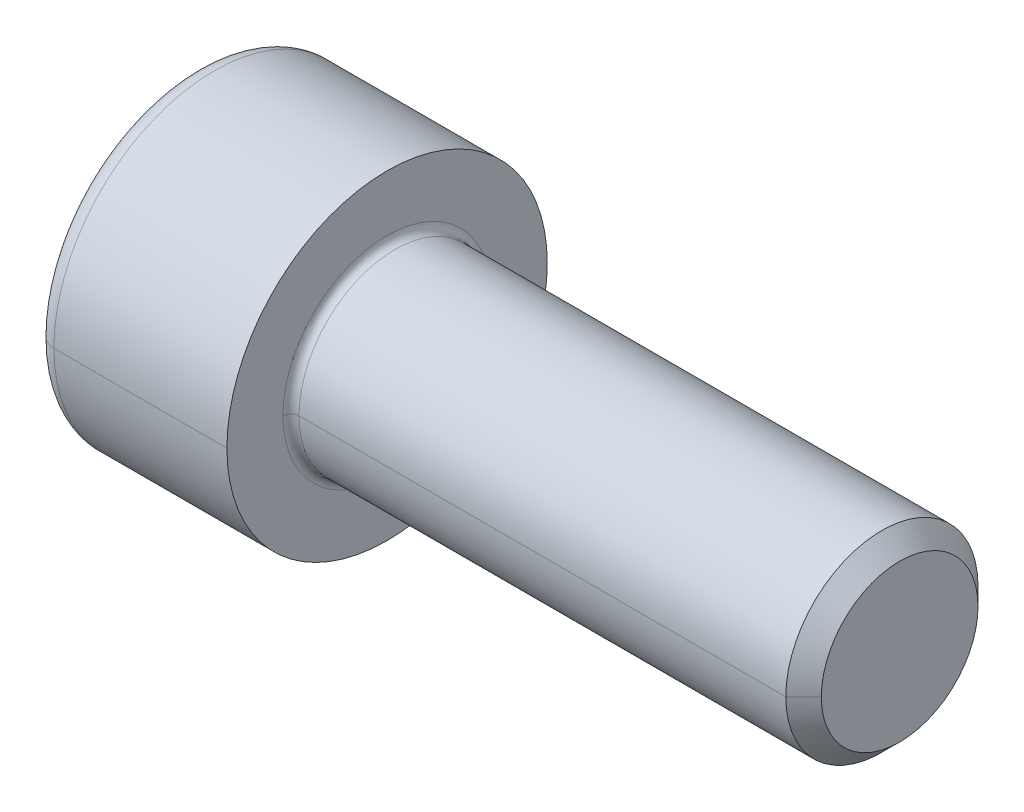
ISO-10303-21;
HEADER;
FILE_DESCRIPTION(('STEP AP214'),'2;1');
FILE_NAME('part.step','',(''),(''),'','','');
FILE_SCHEMA(('AUTOMOTIVE_DESIGN { 1 0 10303 214 1 1 1 1 }'));
ENDSEC;
DATA;
#1=APPLICATION_CONTEXT('core data for automotive mechanical design processes');
#2=APPLICATION_PROTOCOL_DEFINITION('international standard','automotive_design',2000,#1);
#3=PRODUCT_CONTEXT('',#1,'mechanical');
#4=PRODUCT('Part','Part','',(#3));
#5=PRODUCT_RELATED_PRODUCT_CATEGORY('part','',(#4));
#6=PRODUCT_DEFINITION_FORMATION('','',#4);
#7=PRODUCT_DEFINITION_CONTEXT('part definition',#1,'design');
#8=PRODUCT_DEFINITION('design','',#6,#7);
#9=PRODUCT_DEFINITION_SHAPE('','',#8);
#10=(LENGTH_UNIT() NAMED_UNIT(*) SI_UNIT(.MILLI.,.METRE.));
#11=(NAMED_UNIT(*) PLANE_ANGLE_UNIT() SI_UNIT($,.RADIAN.));
#12=(NAMED_UNIT(*) SI_UNIT($,.STERADIAN.) SOLID_ANGLE_UNIT());
#13=UNCERTAINTY_MEASURE_WITH_UNIT(LENGTH_MEASURE(1.E-05),#10,'distance_accuracy_value','');
#14=(GEOMETRIC_REPRESENTATION_CONTEXT(3) GLOBAL_UNCERTAINTY_ASSIGNED_CONTEXT((#13)) GLOBAL_UNIT_ASSIGNED_CONTEXT((#10,
#11,#12)) REPRESENTATION_CONTEXT('',''));
#15=CARTESIAN_POINT('',(0.,0.,0.));
#16=DIRECTION('',(0.,0.,1.));
#17=DIRECTION('',(1.,0.,0.));
#18=AXIS2_PLACEMENT_3D('',#15,#16,#17);
#19=CARTESIAN_POINT('',(3.,0.,0.));
#20=DIRECTION('',(-1.,0.,0.));
#21=DIRECTION('',(0.,0.,1.));
#22=AXIS2_PLACEMENT_3D('',#19,#20,#21);
#23=CONICAL_SURFACE('',#22,2.51,1.0471975511966);
#24=DIRECTION('',(-0.5,0.,-0.866025403784436));
#25=VECTOR('',#24,1.);
#26=CARTESIAN_POINT('',(3.,0.,-2.51));
#27=LINE('',#26,#25);
#28=CARTESIAN_POINT('',(4.44914917566598,0.,0.));
#29=VERTEX_POINT('',#28);
#30=CARTESIAN_POINT('',(3.,0.,-2.51));
#31=VERTEX_POINT('',#30);
#32=EDGE_CURVE('E90',#29,#31,#27,.T.);
#33=ORIENTED_EDGE('',*,*,#32,.F.);
#34=DIRECTION('',(-0.5,0.,0.866025403784436));
#35=VECTOR('',#34,1.);
#36=CARTESIAN_POINT('',(3.,0.,2.51));
#37=LINE('',#36,#35);
#38=CARTESIAN_POINT('',(3.,0.,2.51));
#39=VERTEX_POINT('',#38);
#40=EDGE_CURVE('E236',#29,#39,#37,.T.);
#41=ORIENTED_EDGE('',*,*,#40,.T.);
#42=CARTESIAN_POINT('',(3.,0.,0.));
#43=DIRECTION('',(-1.,0.,0.));
#44=DIRECTION('',(0.,0.,1.));
#45=AXIS2_PLACEMENT_3D('',#42,#43,#44);
#46=CIRCLE('',#45,2.51);
#47=CARTESIAN_POINT('',(3.,2.17372376349894,1.255));
#48=VERTEX_POINT('',#47);
#49=EDGE_CURVE('E78',#39,#48,#46,.T.);
#50=ORIENTED_EDGE('',*,*,#49,.T.);
#51=CARTESIAN_POINT('',(3.,0.,0.));
#52=DIRECTION('',(-1.,0.,0.));
#53=DIRECTION('',(0.,0.,1.));
#54=AXIS2_PLACEMENT_3D('',#51,#52,#53);
#55=CIRCLE('',#54,2.51);
#56=CARTESIAN_POINT('',(3.,2.17372376349894,-1.255));
#57=VERTEX_POINT('',#56);
#58=EDGE_CURVE('E27',#48,#57,#55,.T.);
#59=ORIENTED_EDGE('',*,*,#58,.T.);
#60=CARTESIAN_POINT('',(3.,0.,0.));
#61=DIRECTION('',(-1.,0.,0.));
#62=DIRECTION('',(0.,0.,1.));
#63=AXIS2_PLACEMENT_3D('',#60,#61,#62);
#64=CIRCLE('',#63,2.51);
#65=EDGE_CURVE('E11',#57,#31,#64,.T.);
#66=ORIENTED_EDGE('',*,*,#65,.T.);
#67=EDGE_LOOP('',(#33,#41,#50,#59,#66));
#68=FACE_BOUND('',#67,.T.);
#69=ADVANCED_FACE('F16',(#68),#23,.F.);
#70=CARTESIAN_POINT('',(3.,4.34744752699787,-2.51));
#71=DIRECTION('',(1.,0.,0.));
#72=DIRECTION('',(0.,1.,0.));
#73=AXIS2_PLACEMENT_3D('',#70,#71,#72);
#74=PLANE('',#73);
#75=DIRECTION('',(0.,-0.5,-0.866025403784438));
#76=VECTOR('',#75,1.);
#77=CARTESIAN_POINT('',(3.,2.89829835133192,0.));
#78=LINE('',#77,#76);
#79=CARTESIAN_POINT('',(3.,1.44914917566595,-2.51));
#80=VERTEX_POINT('',#79);
#81=EDGE_CURVE('E306',#57,#80,#78,.T.);
#82=ORIENTED_EDGE('',*,*,#81,.T.);
#83=DIRECTION('',(0.,-1.,0.));
#84=VECTOR('',#83,1.);
#85=CARTESIAN_POINT('',(3.,1.44914917566595,-2.51));
#86=LINE('',#85,#84);
#87=EDGE_CURVE('E288',#80,#31,#86,.T.);
#88=ORIENTED_EDGE('',*,*,#87,.T.);
#89=ORIENTED_EDGE('',*,*,#65,.F.);
#90=EDGE_LOOP('',(#82,#88,#89));
#91=FACE_BOUND('',#90,.T.);
#92=ADVANCED_FACE('F719',(#91),#74,.F.);
#93=CARTESIAN_POINT('',(3.,4.34744752699787,-2.51));
#94=DIRECTION('',(1.,0.,0.));
#95=DIRECTION('',(0.,1.,0.));
#96=AXIS2_PLACEMENT_3D('',#93,#94,#95);
#97=PLANE('',#96);
#98=DIRECTION('',(0.,-0.5,0.866025403784439));
#99=VECTOR('',#98,1.);
#100=CARTESIAN_POINT('',(3.,2.89829835133192,0.));
#101=LINE('',#100,#99);
#102=CARTESIAN_POINT('',(3.,2.89829835133192,0.));
#103=VERTEX_POINT('',#102);
#104=EDGE_CURVE('E255',#103,#48,#101,.T.);
#105=ORIENTED_EDGE('',*,*,#104,.F.);
#106=DIRECTION('',(0.,-0.5,-0.866025403784438));
#107=VECTOR('',#106,1.);
#108=CARTESIAN_POINT('',(3.,2.89829835133192,0.));
#109=LINE('',#108,#107);
#110=EDGE_CURVE('E265',#103,#57,#109,.T.);
#111=ORIENTED_EDGE('',*,*,#110,.T.);
#112=ORIENTED_EDGE('',*,*,#58,.F.);
#113=EDGE_LOOP('',(#105,#111,#112));
#114=FACE_BOUND('',#113,.T.);
#115=ADVANCED_FACE('F724',(#114),#97,.F.);
#116=CARTESIAN_POINT('',(3.,4.34744752699787,-2.51));
#117=DIRECTION('',(1.,0.,0.));
#118=DIRECTION('',(0.,1.,0.));
#119=AXIS2_PLACEMENT_3D('',#116,#117,#118);
#120=PLANE('',#119);
#121=DIRECTION('',(0.,1.,0.));
#122=VECTOR('',#121,1.);
#123=CARTESIAN_POINT('',(3.,-1.44914917566596,2.51));
#124=LINE('',#123,#122);
#125=CARTESIAN_POINT('',(3.,1.44914917566596,2.51));
#126=VERTEX_POINT('',#125);
#127=EDGE_CURVE('E176',#39,#126,#124,.T.);
#128=ORIENTED_EDGE('',*,*,#127,.T.);
#129=DIRECTION('',(0.,-0.5,0.866025403784439));
#130=VECTOR('',#129,1.);
#131=CARTESIAN_POINT('',(3.,2.89829835133192,0.));
#132=LINE('',#131,#130);
#133=EDGE_CURVE('E172',#48,#126,#132,.T.);
#134=ORIENTED_EDGE('',*,*,#133,.F.);
#135=ORIENTED_EDGE('',*,*,#49,.F.);
#136=EDGE_LOOP('',(#128,#134,#135));
#137=FACE_BOUND('',#136,.T.);
#138=ADVANCED_FACE('F729',(#137),#120,.F.);
#139=CARTESIAN_POINT('',(3.,4.34744752699787,-2.51));
#140=DIRECTION('',(1.,0.,0.));
#141=DIRECTION('',(0.,1.,0.));
#142=AXIS2_PLACEMENT_3D('',#139,#140,#141);
#143=PLANE('',#142);
#144=DIRECTION('',(0.,-0.5,-0.866025403784438));
#145=VECTOR('',#144,1.);
#146=CARTESIAN_POINT('',(3.,-1.44914917566596,2.51));
#147=LINE('',#146,#145);
#148=CARTESIAN_POINT('',(3.,-1.44914917566596,2.51));
#149=VERTEX_POINT('',#148);
#150=CARTESIAN_POINT('',(3.,-2.17372376349894,1.255));
#151=VERTEX_POINT('',#150);
#152=EDGE_CURVE('E216',#149,#151,#147,.T.);
#153=ORIENTED_EDGE('',*,*,#152,.F.);
#154=DIRECTION('',(0.,1.,0.));
#155=VECTOR('',#154,1.);
#156=CARTESIAN_POINT('',(3.,-1.44914917566596,2.51));
#157=LINE('',#156,#155);
#158=EDGE_CURVE('E217',#149,#39,#157,.T.);
#159=ORIENTED_EDGE('',*,*,#158,.T.);
#160=CARTESIAN_POINT('',(3.,0.,0.));
#161=DIRECTION('',(-1.,0.,0.));
#162=DIRECTION('',(0.,0.,1.));
#163=AXIS2_PLACEMENT_3D('',#160,#161,#162);
#164=CIRCLE('',#163,2.51);
#165=EDGE_CURVE('E377',#151,#39,#164,.T.);
#166=ORIENTED_EDGE('',*,*,#165,.F.);
#167=EDGE_LOOP('',(#153,#159,#166));
#168=FACE_BOUND('',#167,.T.);
#169=ADVANCED_FACE('F703',(#168),#143,.F.);
#170=CARTESIAN_POINT('',(3.,4.34744752699787,-2.51));
#171=DIRECTION('',(1.,0.,0.));
#172=DIRECTION('',(0.,1.,0.));
#173=AXIS2_PLACEMENT_3D('',#170,#171,#172);
#174=PLANE('',#173);
#175=DIRECTION('',(0.,0.5,-0.866025403784439));
#176=VECTOR('',#175,1.);
#177=CARTESIAN_POINT('',(3.,-2.89829835133192,0.));
#178=LINE('',#177,#176);
#179=CARTESIAN_POINT('',(3.,-2.89829835133192,0.));
#180=VERTEX_POINT('',#179);
#181=CARTESIAN_POINT('',(3.,-2.17372376349894,-1.255));
#182=VERTEX_POINT('',#181);
#183=EDGE_CURVE('E249',#180,#182,#178,.T.);
#184=ORIENTED_EDGE('',*,*,#183,.F.);
#185=DIRECTION('',(0.,-0.5,-0.866025403784438));
#186=VECTOR('',#185,1.);
#187=CARTESIAN_POINT('',(3.,-1.44914917566596,2.51));
#188=LINE('',#187,#186);
#189=EDGE_CURVE('E250',#151,#180,#188,.T.);
#190=ORIENTED_EDGE('',*,*,#189,.F.);
#191=CARTESIAN_POINT('',(3.,0.,0.));
#192=DIRECTION('',(-1.,0.,0.));
#193=DIRECTION('',(0.,0.,1.));
#194=AXIS2_PLACEMENT_3D('',#191,#192,#193);
#195=CIRCLE('',#194,2.51);
#196=EDGE_CURVE('E222',#182,#151,#195,.T.);
#197=ORIENTED_EDGE('',*,*,#196,.F.);
#198=EDGE_LOOP('',(#184,#190,#197));
#199=FACE_BOUND('',#198,.T.);
#200=ADVANCED_FACE('F699',(#199),#174,.F.);
#201=CARTESIAN_POINT('',(3.,4.34744752699787,-2.51));
#202=DIRECTION('',(1.,0.,0.));
#203=DIRECTION('',(0.,1.,0.));
#204=AXIS2_PLACEMENT_3D('',#201,#202,#203);
#205=PLANE('',#204);
#206=DIRECTION('',(0.,-1.,0.));
#207=VECTOR('',#206,1.);
#208=CARTESIAN_POINT('',(3.,1.44914917566595,-2.51));
#209=LINE('',#208,#207);
#210=CARTESIAN_POINT('',(3.,-1.44914917566597,-2.51));
#211=VERTEX_POINT('',#210);
#212=EDGE_CURVE('E286',#31,#211,#209,.T.);
#213=ORIENTED_EDGE('',*,*,#212,.T.);
#214=DIRECTION('',(0.,0.5,-0.866025403784439));
#215=VECTOR('',#214,1.);
#216=CARTESIAN_POINT('',(3.,-2.89829835133192,0.));
#217=LINE('',#216,#215);
#218=EDGE_CURVE('E262',#182,#211,#217,.T.);
#219=ORIENTED_EDGE('',*,*,#218,.F.);
#220=CARTESIAN_POINT('',(3.,0.,0.));
#221=DIRECTION('',(-1.,0.,0.));
#222=DIRECTION('',(0.,0.,1.));
#223=AXIS2_PLACEMENT_3D('',#220,#221,#222);
#224=CIRCLE('',#223,2.51);
#225=EDGE_CURVE('E218',#31,#182,#224,.T.);
#226=ORIENTED_EDGE('',*,*,#225,.F.);
#227=EDGE_LOOP('',(#213,#219,#226));
#228=FACE_BOUND('',#227,.T.);
#229=ADVANCED_FACE('F706',(#228),#205,.F.);
#230=CARTESIAN_POINT('',(3.,2.89829835133192,0.));
#231=DIRECTION('',(0.,0.866025403784438,-0.5));
#232=DIRECTION('',(-1.,0.,0.));
#233=AXIS2_PLACEMENT_3D('',#230,#231,#232);
#234=PLANE('',#233);
#235=DIRECTION('',(0.,-0.5,-0.866025403784438));
#236=VECTOR('',#235,1.);
#237=CARTESIAN_POINT('',(0.,2.89829835133192,0.));
#238=LINE('',#237,#236);
#239=CARTESIAN_POINT('',(0.,2.89829835133192,0.));
#240=VERTEX_POINT('',#239);
#241=CARTESIAN_POINT('',(0.,1.44914917566595,-2.51));
#242=VERTEX_POINT('',#241);
#243=EDGE_CURVE('E195',#240,#242,#238,.T.);
#244=ORIENTED_EDGE('',*,*,#243,.T.);
#245=DIRECTION('',(-1.,0.,0.));
#246=VECTOR('',#245,1.);
#247=CARTESIAN_POINT('',(3.,1.44914917566595,-2.51));
#248=LINE('',#247,#246);
#249=EDGE_CURVE('E309',#80,#242,#248,.T.);
#250=ORIENTED_EDGE('',*,*,#249,.F.);
#251=ORIENTED_EDGE('',*,*,#81,.F.);
#252=ORIENTED_EDGE('',*,*,#110,.F.);
#253=DIRECTION('',(-1.,0.,0.));
#254=VECTOR('',#253,1.);
#255=CARTESIAN_POINT('',(3.,2.89829835133192,0.));
#256=LINE('',#255,#254);
#257=EDGE_CURVE('E257',#103,#240,#256,.T.);
#258=ORIENTED_EDGE('',*,*,#257,.T.);
#259=EDGE_LOOP('',(#244,#250,#251,#252,#258));
#260=FACE_BOUND('',#259,.T.);
#261=ADVANCED_FACE('F333',(#260),#234,.F.);
#262=CARTESIAN_POINT('',(3.,1.44914917566595,-2.51));
#263=DIRECTION('',(0.,0.,-1.));
#264=DIRECTION('',(0.,-1.,0.));
#265=AXIS2_PLACEMENT_3D('',#262,#263,#264);
#266=PLANE('',#265);
#267=DIRECTION('',(0.,-1.,0.));
#268=VECTOR('',#267,1.);
#269=CARTESIAN_POINT('',(0.,1.44914917566595,-2.51));
#270=LINE('',#269,#268);
#271=CARTESIAN_POINT('',(0.,-1.44914917566597,-2.51));
#272=VERTEX_POINT('',#271);
#273=EDGE_CURVE('E266',#242,#272,#270,.T.);
#274=ORIENTED_EDGE('',*,*,#273,.T.);
#275=DIRECTION('',(-1.,0.,0.));
#276=VECTOR('',#275,1.);
#277=CARTESIAN_POINT('',(3.,-1.44914917566597,-2.51));
#278=LINE('',#277,#276);
#279=EDGE_CURVE('E274',#211,#272,#278,.T.);
#280=ORIENTED_EDGE('',*,*,#279,.F.);
#281=ORIENTED_EDGE('',*,*,#212,.F.);
#282=ORIENTED_EDGE('',*,*,#87,.F.);
#283=ORIENTED_EDGE('',*,*,#249,.T.);
#284=EDGE_LOOP('',(#274,#280,#281,#282,#283));
#285=FACE_BOUND('',#284,.T.);
#286=ADVANCED_FACE('F340',(#285),#266,.F.);
#287=CARTESIAN_POINT('',(3.,-2.89829835133192,0.));
#288=DIRECTION('',(0.,0.866025403784439,0.5));
#289=DIRECTION('',(1.,0.,0.));
#290=AXIS2_PLACEMENT_3D('',#287,#288,#289);
#291=PLANE('',#290);
#292=DIRECTION('',(0.,0.5,-0.866025403784439));
#293=VECTOR('',#292,1.);
#294=CARTESIAN_POINT('',(0.,-2.89829835133192,0.));
#295=LINE('',#294,#293);
#296=CARTESIAN_POINT('',(0.,-2.89829835133192,0.));
#297=VERTEX_POINT('',#296);
#298=EDGE_CURVE('E270',#297,#272,#295,.T.);
#299=ORIENTED_EDGE('',*,*,#298,.F.);
#300=DIRECTION('',(-1.,0.,0.));
#301=VECTOR('',#300,1.);
#302=CARTESIAN_POINT('',(3.,-2.89829835133192,0.));
#303=LINE('',#302,#301);
#304=EDGE_CURVE('E245',#180,#297,#303,.T.);
#305=ORIENTED_EDGE('',*,*,#304,.F.);
#306=ORIENTED_EDGE('',*,*,#183,.T.);
#307=ORIENTED_EDGE('',*,*,#218,.T.);
#308=ORIENTED_EDGE('',*,*,#279,.T.);
#309=EDGE_LOOP('',(#299,#305,#306,#307,#308));
#310=FACE_BOUND('',#309,.T.);
#311=ADVANCED_FACE('F701',(#310),#291,.T.);
#312=CARTESIAN_POINT('',(3.,-1.44914917566596,2.51));
#313=DIRECTION('',(0.,0.866025403784438,-0.5));
#314=DIRECTION('',(-1.,0.,0.));
#315=AXIS2_PLACEMENT_3D('',#312,#313,#314);
#316=PLANE('',#315);
#317=DIRECTION('',(0.,-0.5,-0.866025403784438));
#318=VECTOR('',#317,1.);
#319=CARTESIAN_POINT('',(0.,-1.44914917566596,2.51));
#320=LINE('',#319,#318);
#321=CARTESIAN_POINT('',(0.,-1.44914917566596,2.51));
#322=VERTEX_POINT('',#321);
#323=EDGE_CURVE('E188',#322,#297,#320,.T.);
#324=ORIENTED_EDGE('',*,*,#323,.F.);
#325=DIRECTION('',(-1.,0.,0.));
#326=VECTOR('',#325,1.);
#327=CARTESIAN_POINT('',(3.,-1.44914917566596,2.51));
#328=LINE('',#327,#326);
#329=EDGE_CURVE('E183',#149,#322,#328,.T.);
#330=ORIENTED_EDGE('',*,*,#329,.F.);
#331=ORIENTED_EDGE('',*,*,#152,.T.);
#332=ORIENTED_EDGE('',*,*,#189,.T.);
#333=ORIENTED_EDGE('',*,*,#304,.T.);
#334=EDGE_LOOP('',(#324,#330,#331,#332,#333));
#335=FACE_BOUND('',#334,.T.);
#336=ADVANCED_FACE('F695',(#335),#316,.T.);
#337=CARTESIAN_POINT('',(3.,-1.44914917566596,2.51));
#338=DIRECTION('',(0.,0.,1.));
#339=DIRECTION('',(0.,-1.,0.));
#340=AXIS2_PLACEMENT_3D('',#337,#338,#339);
#341=PLANE('',#340);
#342=DIRECTION('',(0.,1.,0.));
#343=VECTOR('',#342,1.);
#344=CARTESIAN_POINT('',(0.,-1.44914917566596,2.51));
#345=LINE('',#344,#343);
#346=CARTESIAN_POINT('',(0.,1.44914917566596,2.51));
#347=VERTEX_POINT('',#346);
#348=EDGE_CURVE('E179',#322,#347,#345,.T.);
#349=ORIENTED_EDGE('',*,*,#348,.T.);
#350=DIRECTION('',(-1.,0.,0.));
#351=VECTOR('',#350,1.);
#352=CARTESIAN_POINT('',(3.,1.44914917566596,2.51));
#353=LINE('',#352,#351);
#354=EDGE_CURVE('E165',#126,#347,#353,.T.);
#355=ORIENTED_EDGE('',*,*,#354,.F.);
#356=ORIENTED_EDGE('',*,*,#127,.F.);
#357=ORIENTED_EDGE('',*,*,#158,.F.);
#358=ORIENTED_EDGE('',*,*,#329,.T.);
#359=EDGE_LOOP('',(#349,#355,#356,#357,#358));
#360=FACE_BOUND('',#359,.T.);
#361=ADVANCED_FACE('F180',(#360),#341,.F.);
#362=CARTESIAN_POINT('',(3.,2.89829835133192,0.));
#363=DIRECTION('',(0.,-0.866025403784439,-0.5));
#364=DIRECTION('',(0.,0.5,-0.866025403784439));
#365=AXIS2_PLACEMENT_3D('',#362,#363,#364);
#366=PLANE('',#365);
#367=DIRECTION('',(0.,-0.5,0.866025403784439));
#368=VECTOR('',#367,1.);
#369=CARTESIAN_POINT('',(0.,2.89829835133192,0.));
#370=LINE('',#369,#368);
#371=EDGE_CURVE('E170',#240,#347,#370,.T.);
#372=ORIENTED_EDGE('',*,*,#371,.F.);
#373=ORIENTED_EDGE('',*,*,#257,.F.);
#374=ORIENTED_EDGE('',*,*,#104,.T.);
#375=ORIENTED_EDGE('',*,*,#133,.T.);
#376=ORIENTED_EDGE('',*,*,#354,.T.);
#377=EDGE_LOOP('',(#372,#373,#374,#375,#376));
#378=FACE_BOUND('',#377,.T.);
#379=ADVANCED_FACE('F167',(#378),#366,.T.);
#380=CARTESIAN_POINT('',(0.6,0.,0.));
#381=DIRECTION('',(-1.,0.,0.));
#382=DIRECTION('',(0.,0.,1.));
#383=AXIS2_PLACEMENT_3D('',#380,#381,#382);
#384=TOROIDAL_SURFACE('',#383,4.4,0.6);
#385=CARTESIAN_POINT('',(0.6,0.,-4.4));
#386=DIRECTION('',(0.,1.,0.));
#387=DIRECTION('',(0.,0.,1.));
#388=AXIS2_PLACEMENT_3D('',#385,#386,#387);
#389=CIRCLE('',#388,0.6);
#390=CARTESIAN_POINT('',(0.6,0.,-5.));
#391=VERTEX_POINT('',#390);
#392=CARTESIAN_POINT('',(0.,0.,-4.4));
#393=VERTEX_POINT('',#392);
#394=EDGE_CURVE('E227',#391,#393,#389,.T.);
#395=ORIENTED_EDGE('',*,*,#394,.F.);
#396=CARTESIAN_POINT('',(0.6,0.,0.));
#397=DIRECTION('',(1.,0.,0.));
#398=DIRECTION('',(0.,0.,1.));
#399=AXIS2_PLACEMENT_3D('',#396,#397,#398);
#400=CIRCLE('',#399,5.);
#401=CARTESIAN_POINT('',(0.6,0.,5.));
#402=VERTEX_POINT('',#401);
#403=EDGE_CURVE('E317',#402,#391,#400,.T.);
#404=ORIENTED_EDGE('',*,*,#403,.F.);
#405=CARTESIAN_POINT('',(0.6,0.,4.4));
#406=DIRECTION('',(0.,-1.,0.));
#407=DIRECTION('',(0.,0.,-1.));
#408=AXIS2_PLACEMENT_3D('',#405,#406,#407);
#409=CIRCLE('',#408,0.6);
#410=CARTESIAN_POINT('',(0.,0.,4.4));
#411=VERTEX_POINT('',#410);
#412=EDGE_CURVE('E213',#402,#411,#409,.T.);
#413=ORIENTED_EDGE('',*,*,#412,.T.);
#414=CARTESIAN_POINT('',(0.,0.,0.));
#415=DIRECTION('',(-1.,0.,0.));
#416=DIRECTION('',(0.,0.,1.));
#417=AXIS2_PLACEMENT_3D('',#414,#415,#416);
#418=CIRCLE('',#417,4.4);
#419=EDGE_CURVE('E197',#393,#411,#418,.T.);
#420=ORIENTED_EDGE('',*,*,#419,.F.);
#421=EDGE_LOOP('',(#395,#404,#413,#420));
#422=FACE_BOUND('',#421,.T.);
#423=ADVANCED_FACE('F418',(#422),#384,.T.);
#424=CARTESIAN_POINT('',(6.25,0.,0.));
#425=DIRECTION('',(1.,0.,0.));
#426=DIRECTION('',(0.,0.,-1.));
#427=AXIS2_PLACEMENT_3D('',#424,#425,#426);
#428=TOROIDAL_SURFACE('',#427,3.25,0.25);
#429=CARTESIAN_POINT('',(6.25,0.,3.25));
#430=DIRECTION('',(0.,1.,0.));
#431=DIRECTION('',(0.,0.,1.));
#432=AXIS2_PLACEMENT_3D('',#429,#430,#431);
#433=CIRCLE('',#432,0.25);
#434=CARTESIAN_POINT('',(6.25,0.,3.));
#435=VERTEX_POINT('',#434);
#436=CARTESIAN_POINT('',(6.,0.,3.25));
#437=VERTEX_POINT('',#436);
#438=EDGE_CURVE('E212',#435,#437,#433,.T.);
#439=ORIENTED_EDGE('',*,*,#438,.F.);
#440=CARTESIAN_POINT('',(6.25,0.,0.));
#441=DIRECTION('',(1.,0.,0.));
#442=DIRECTION('',(0.,0.,-1.));
#443=AXIS2_PLACEMENT_3D('',#440,#441,#442);
#444=CIRCLE('',#443,3.);
#445=CARTESIAN_POINT('',(6.25,0.,-3.));
#446=VERTEX_POINT('',#445);
#447=EDGE_CURVE('E372',#446,#435,#444,.T.);
#448=ORIENTED_EDGE('',*,*,#447,.F.);
#449=CARTESIAN_POINT('',(6.25,0.,-3.25));
#450=DIRECTION('',(0.,-1.,0.));
#451=DIRECTION('',(0.,0.,-1.));
#452=AXIS2_PLACEMENT_3D('',#449,#450,#451);
#453=CIRCLE('',#452,0.25);
#454=CARTESIAN_POINT('',(6.,0.,-3.25));
#455=VERTEX_POINT('',#454);
#456=EDGE_CURVE('E293',#446,#455,#453,.T.);
#457=ORIENTED_EDGE('',*,*,#456,.T.);
#458=CARTESIAN_POINT('',(6.,0.,0.));
#459=DIRECTION('',(-1.,0.,0.));
#460=DIRECTION('',(0.,0.,-1.));
#461=AXIS2_PLACEMENT_3D('',#458,#459,#460);
#462=CIRCLE('',#461,3.25);
#463=EDGE_CURVE('E320',#437,#455,#462,.T.);
#464=ORIENTED_EDGE('',*,*,#463,.F.);
#465=EDGE_LOOP('',(#439,#448,#457,#464));
#466=FACE_BOUND('',#465,.T.);
#467=ADVANCED_FACE('F800',(#466),#428,.F.);
#468=CARTESIAN_POINT('',(-31.75,0.,0.));
#469=DIRECTION('',(-1.,0.,0.));
#470=DIRECTION('',(0.,0.,1.));
#471=AXIS2_PLACEMENT_3D('',#468,#469,#470);
#472=CYLINDRICAL_SURFACE('',#471,5.);
#473=DIRECTION('',(-1.,0.,0.));
#474=VECTOR('',#473,1.);
#475=CARTESIAN_POINT('',(-31.75,0.,-5.));
#476=LINE('',#475,#474);
#477=CARTESIAN_POINT('',(6.,0.,-5.));
#478=VERTEX_POINT('',#477);
#479=EDGE_CURVE('E285',#478,#391,#476,.T.);
#480=ORIENTED_EDGE('',*,*,#479,.F.);
#481=CARTESIAN_POINT('',(6.,0.,0.));
#482=DIRECTION('',(-1.,0.,0.));
#483=DIRECTION('',(0.,0.,1.));
#484=AXIS2_PLACEMENT_3D('',#481,#482,#483);
#485=CIRCLE('',#484,5.);
#486=CARTESIAN_POINT('',(6.,0.,5.));
#487=VERTEX_POINT('',#486);
#488=EDGE_CURVE('E323',#478,#487,#485,.T.);
#489=ORIENTED_EDGE('',*,*,#488,.T.);
#490=DIRECTION('',(-1.,0.,0.));
#491=VECTOR('',#490,1.);
#492=CARTESIAN_POINT('',(-31.75,0.,5.));
#493=LINE('',#492,#491);
#494=EDGE_CURVE('E244',#487,#402,#493,.T.);
#495=ORIENTED_EDGE('',*,*,#494,.T.);
#496=ORIENTED_EDGE('',*,*,#403,.T.);
#497=EDGE_LOOP('',(#480,#489,#495,#496));
#498=FACE_BOUND('',#497,.T.);
#499=ADVANCED_FACE('F440',(#498),#472,.T.);
#500=CARTESIAN_POINT('',(6.,5.,0.));
#501=DIRECTION('',(1.,0.,0.));
#502=DIRECTION('',(0.,1.,0.));
#503=AXIS2_PLACEMENT_3D('',#500,#501,#502);
#504=PLANE('',#503);
#505=CARTESIAN_POINT('',(6.,0.,0.));
#506=DIRECTION('',(-1.,0.,0.));
#507=DIRECTION('',(0.,0.,-1.));
#508=AXIS2_PLACEMENT_3D('',#505,#506,#507);
#509=CIRCLE('',#508,3.25);
#510=EDGE_CURVE('E231',#455,#437,#509,.T.);
#511=ORIENTED_EDGE('',*,*,#510,.T.);
#512=ORIENTED_EDGE('',*,*,#463,.T.);
#513=EDGE_LOOP('',(#511,#512));
#514=FACE_BOUND('',#513,.T.);
#515=CARTESIAN_POINT('',(6.,0.,0.));
#516=DIRECTION('',(-1.,0.,0.));
#517=DIRECTION('',(0.,0.,1.));
#518=AXIS2_PLACEMENT_3D('',#515,#516,#517);
#519=CIRCLE('',#518,5.);
#520=EDGE_CURVE('E20',#487,#478,#519,.T.);
#521=ORIENTED_EDGE('',*,*,#520,.F.);
#522=ORIENTED_EDGE('',*,*,#488,.F.);
#523=EDGE_LOOP('',(#521,#522));
#524=FACE_BOUND('',#523,.T.);
#525=ADVANCED_FACE('F438',(#514,#524),#504,.T.);
#526=CARTESIAN_POINT('',(-31.75,0.,0.));
#527=DIRECTION('',(-1.,0.,0.));
#528=DIRECTION('',(0.,0.,1.));
#529=AXIS2_PLACEMENT_3D('',#526,#527,#528);
#530=CYLINDRICAL_SURFACE('',#529,3.);
#531=DIRECTION('',(-1.,0.,0.));
#532=VECTOR('',#531,1.);
#533=CARTESIAN_POINT('',(-31.75,0.,-3.));
#534=LINE('',#533,#532);
#535=CARTESIAN_POINT('',(21.4455,0.,-3.));
#536=VERTEX_POINT('',#535);
#537=EDGE_CURVE('E243',#536,#446,#534,.T.);
#538=ORIENTED_EDGE('',*,*,#537,.F.);
#539=CARTESIAN_POINT('',(21.4455,0.,0.));
#540=DIRECTION('',(-1.,0.,0.));
#541=DIRECTION('',(0.,0.,1.));
#542=AXIS2_PLACEMENT_3D('',#539,#540,#541);
#543=CIRCLE('',#542,3.);
#544=CARTESIAN_POINT('',(21.4455,0.,3.));
#545=VERTEX_POINT('',#544);
#546=EDGE_CURVE('E234',#536,#545,#543,.T.);
#547=ORIENTED_EDGE('',*,*,#546,.T.);
#548=DIRECTION('',(-1.,0.,0.));
#549=VECTOR('',#548,1.);
#550=CARTESIAN_POINT('',(-31.75,0.,3.));
#551=LINE('',#550,#549);
#552=EDGE_CURVE('E299',#545,#435,#551,.T.);
#553=ORIENTED_EDGE('',*,*,#552,.T.);
#554=CARTESIAN_POINT('',(6.25,0.,0.));
#555=DIRECTION('',(1.,0.,0.));
#556=DIRECTION('',(0.,0.,-1.));
#557=AXIS2_PLACEMENT_3D('',#554,#555,#556);
#558=CIRCLE('',#557,3.);
#559=EDGE_CURVE('E208',#435,#446,#558,.T.);
#560=ORIENTED_EDGE('',*,*,#559,.T.);
#561=EDGE_LOOP('',(#538,#547,#553,#560));
#562=FACE_BOUND('',#561,.T.);
#563=ADVANCED_FACE('F18',(#562),#530,.T.);
#564=CARTESIAN_POINT('',(22.,0.,0.));
#565=DIRECTION('',(-1.,0.,0.));
#566=DIRECTION('',(0.,0.,1.));
#567=AXIS2_PLACEMENT_3D('',#564,#565,#566);
#568=CONICAL_SURFACE('',#567,2.4455,0.785398163397432);
#569=DIRECTION('',(-0.707106781186559,0.,-0.707106781186536));
#570=VECTOR('',#569,1.);
#571=CARTESIAN_POINT('',(22.,0.,-2.4455));
#572=LINE('',#571,#570);
#573=CARTESIAN_POINT('',(22.,0.,-2.4455));
#574=VERTEX_POINT('',#573);
#575=EDGE_CURVE('E298',#574,#536,#572,.T.);
#576=ORIENTED_EDGE('',*,*,#575,.F.);
#577=CARTESIAN_POINT('',(22.,0.,0.));
#578=DIRECTION('',(-1.,0.,0.));
#579=DIRECTION('',(0.,0.,1.));
#580=AXIS2_PLACEMENT_3D('',#577,#578,#579);
#581=CIRCLE('',#580,2.4455);
#582=CARTESIAN_POINT('',(22.,0.,2.4455));
#583=VERTEX_POINT('',#582);
#584=EDGE_CURVE('E232',#574,#583,#581,.T.);
#585=ORIENTED_EDGE('',*,*,#584,.T.);
#586=DIRECTION('',(-0.707106781186559,0.,0.707106781186536));
#587=VECTOR('',#586,1.);
#588=CARTESIAN_POINT('',(22.,0.,2.4455));
#589=LINE('',#588,#587);
#590=EDGE_CURVE('E203',#583,#545,#589,.T.);
#591=ORIENTED_EDGE('',*,*,#590,.T.);
#592=ORIENTED_EDGE('',*,*,#546,.F.);
#593=EDGE_LOOP('',(#576,#585,#591,#592));
#594=FACE_BOUND('',#593,.T.);
#595=ADVANCED_FACE('F809',(#594),#568,.T.);
#596=CARTESIAN_POINT('',(22.,2.4455,0.));
#597=DIRECTION('',(1.,0.,0.));
#598=DIRECTION('',(0.,1.,0.));
#599=AXIS2_PLACEMENT_3D('',#596,#597,#598);
#600=PLANE('',#599);
#601=CARTESIAN_POINT('',(22.,0.,0.));
#602=DIRECTION('',(-1.,0.,0.));
#603=DIRECTION('',(0.,0.,1.));
#604=AXIS2_PLACEMENT_3D('',#601,#602,#603);
#605=CIRCLE('',#604,2.4455);
#606=EDGE_CURVE('E294',#583,#574,#605,.T.);
#607=ORIENTED_EDGE('',*,*,#606,.F.);
#608=ORIENTED_EDGE('',*,*,#584,.F.);
#609=EDGE_LOOP('',(#607,#608));
#610=FACE_BOUND('',#609,.T.);
#611=ADVANCED_FACE('F814',(#610),#600,.T.);
#612=CARTESIAN_POINT('',(0.,0.,0.));
#613=DIRECTION('',(-1.,0.,0.));
#614=DIRECTION('',(0.,0.,1.));
#615=AXIS2_PLACEMENT_3D('',#612,#613,#614);
#616=PLANE('',#615);
#617=ORIENTED_EDGE('',*,*,#371,.T.);
#618=ORIENTED_EDGE('',*,*,#348,.F.);
#619=ORIENTED_EDGE('',*,*,#323,.T.);
#620=ORIENTED_EDGE('',*,*,#298,.T.);
#621=ORIENTED_EDGE('',*,*,#273,.F.);
#622=ORIENTED_EDGE('',*,*,#243,.F.);
#623=EDGE_LOOP('',(#617,#618,#619,#620,#621,#622));
#624=FACE_BOUND('',#623,.T.);
#625=CARTESIAN_POINT('',(0.,0.,0.));
#626=DIRECTION('',(-1.,0.,0.));
#627=DIRECTION('',(0.,0.,1.));
#628=AXIS2_PLACEMENT_3D('',#625,#626,#627);
#629=CIRCLE('',#628,4.4);
#630=EDGE_CURVE('E223',#411,#393,#629,.T.);
#631=ORIENTED_EDGE('',*,*,#630,.T.);
#632=ORIENTED_EDGE('',*,*,#419,.T.);
#633=EDGE_LOOP('',(#631,#632));
#634=FACE_BOUND('',#633,.T.);
#635=ADVANCED_FACE('F191',(#624,#634),#616,.T.);
#636=CARTESIAN_POINT('',(22.,0.,0.));
#637=DIRECTION('',(-1.,0.,0.));
#638=DIRECTION('',(0.,0.,1.));
#639=AXIS2_PLACEMENT_3D('',#636,#637,#638);
#640=CONICAL_SURFACE('',#639,2.4455,0.785398163397432);
#641=ORIENTED_EDGE('',*,*,#606,.T.);
#642=ORIENTED_EDGE('',*,*,#575,.T.);
#643=CARTESIAN_POINT('',(21.4455,0.,0.));
#644=DIRECTION('',(-1.,0.,0.));
#645=DIRECTION('',(0.,0.,1.));
#646=AXIS2_PLACEMENT_3D('',#643,#644,#645);
#647=CIRCLE('',#646,3.);
#648=EDGE_CURVE('E239',#545,#536,#647,.T.);
#649=ORIENTED_EDGE('',*,*,#648,.F.);
#650=ORIENTED_EDGE('',*,*,#590,.F.);
#651=EDGE_LOOP('',(#641,#642,#649,#650));
#652=FACE_BOUND('',#651,.T.);
#653=ADVANCED_FACE('F830',(#652),#640,.T.);
#654=CARTESIAN_POINT('',(-31.75,0.,0.));
#655=DIRECTION('',(-1.,0.,0.));
#656=DIRECTION('',(0.,0.,1.));
#657=AXIS2_PLACEMENT_3D('',#654,#655,#656);
#658=CYLINDRICAL_SURFACE('',#657,3.);
#659=ORIENTED_EDGE('',*,*,#648,.T.);
#660=ORIENTED_EDGE('',*,*,#537,.T.);
#661=ORIENTED_EDGE('',*,*,#447,.T.);
#662=ORIENTED_EDGE('',*,*,#552,.F.);
#663=EDGE_LOOP('',(#659,#660,#661,#662));
#664=FACE_BOUND('',#663,.T.);
#665=ADVANCED_FACE('F804',(#664),#658,.T.);
#666=CARTESIAN_POINT('',(-31.75,0.,0.));
#667=DIRECTION('',(-1.,0.,0.));
#668=DIRECTION('',(0.,0.,1.));
#669=AXIS2_PLACEMENT_3D('',#666,#667,#668);
#670=CYLINDRICAL_SURFACE('',#669,5.);
#671=ORIENTED_EDGE('',*,*,#520,.T.);
#672=ORIENTED_EDGE('',*,*,#479,.T.);
#673=CARTESIAN_POINT('',(0.6,0.,0.));
#674=DIRECTION('',(1.,0.,0.));
#675=DIRECTION('',(0.,0.,1.));
#676=AXIS2_PLACEMENT_3D('',#673,#674,#675);
#677=CIRCLE('',#676,5.);
#678=EDGE_CURVE('E254',#391,#402,#677,.T.);
#679=ORIENTED_EDGE('',*,*,#678,.T.);
#680=ORIENTED_EDGE('',*,*,#494,.F.);
#681=EDGE_LOOP('',(#671,#672,#679,#680));
#682=FACE_BOUND('',#681,.T.);
#683=ADVANCED_FACE('F441',(#682),#670,.T.);
#684=CARTESIAN_POINT('',(6.25,0.,0.));
#685=DIRECTION('',(1.,0.,0.));
#686=DIRECTION('',(0.,0.,-1.));
#687=AXIS2_PLACEMENT_3D('',#684,#685,#686);
#688=TOROIDAL_SURFACE('',#687,3.25,0.25);
#689=ORIENTED_EDGE('',*,*,#559,.F.);
#690=ORIENTED_EDGE('',*,*,#438,.T.);
#691=ORIENTED_EDGE('',*,*,#510,.F.);
#692=ORIENTED_EDGE('',*,*,#456,.F.);
#693=EDGE_LOOP('',(#689,#690,#691,#692));
#694=FACE_BOUND('',#693,.T.);
#695=ADVANCED_FACE('F807',(#694),#688,.F.);
#696=CARTESIAN_POINT('',(0.6,0.,0.));
#697=DIRECTION('',(-1.,0.,0.));
#698=DIRECTION('',(0.,0.,1.));
#699=AXIS2_PLACEMENT_3D('',#696,#697,#698);
#700=TOROIDAL_SURFACE('',#699,4.4,0.6);
#701=ORIENTED_EDGE('',*,*,#678,.F.);
#702=ORIENTED_EDGE('',*,*,#394,.T.);
#703=ORIENTED_EDGE('',*,*,#630,.F.);
#704=ORIENTED_EDGE('',*,*,#412,.F.);
#705=EDGE_LOOP('',(#701,#702,#703,#704));
#706=FACE_BOUND('',#705,.T.);
#707=ADVANCED_FACE('F420',(#706),#700,.T.);
#708=CARTESIAN_POINT('',(3.,0.,0.));
#709=DIRECTION('',(-1.,0.,0.));
#710=DIRECTION('',(0.,0.,1.));
#711=AXIS2_PLACEMENT_3D('',#708,#709,#710);
#712=CONICAL_SURFACE('',#711,2.51,1.0471975511966);
#713=ORIENTED_EDGE('',*,*,#40,.F.);
#714=ORIENTED_EDGE('',*,*,#32,.T.);
#715=ORIENTED_EDGE('',*,*,#225,.T.);
#716=ORIENTED_EDGE('',*,*,#196,.T.);
#717=ORIENTED_EDGE('',*,*,#165,.T.);
#718=EDGE_LOOP('',(#713,#714,#715,#716,#717));
#719=FACE_BOUND('',#718,.T.);
#720=ADVANCED_FACE('F704',(#719),#712,.F.);
#721=CLOSED_SHELL('',(#69,#92,#115,#138,#169,#200,#229,#261,#286,#311,#336,#361,#379,#423,#467,
#499,#525,#563,#595,#611,#635,#653,#665,#683,#695,#707,#720));
#722=MANIFOLD_SOLID_BREP('B1',#721);
#723=ADVANCED_BREP_SHAPE_REPRESENTATION('',(#18,#722),#14);
#724=SHAPE_DEFINITION_REPRESENTATION(#9,#723);
ENDSEC;
END-ISO-10303-21;
